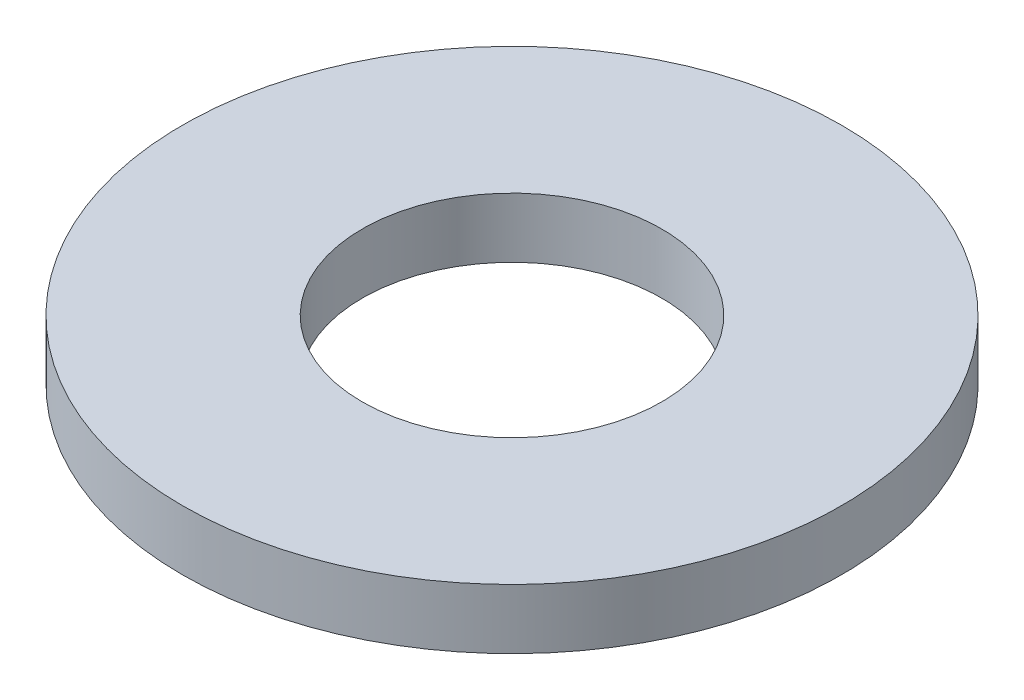
ISO-10303-21;
HEADER;
FILE_DESCRIPTION(('STEP AP214'),'2;1');
FILE_NAME('part.step','',(''),(''),'','','');
FILE_SCHEMA(('AUTOMOTIVE_DESIGN { 1 0 10303 214 1 1 1 1 }'));
ENDSEC;
DATA;
#1=APPLICATION_CONTEXT('core data for automotive mechanical design processes');
#2=APPLICATION_PROTOCOL_DEFINITION('international standard','automotive_design',2000,#1);
#3=PRODUCT_CONTEXT('',#1,'mechanical');
#4=PRODUCT('Part','Part','',(#3));
#5=PRODUCT_RELATED_PRODUCT_CATEGORY('part','',(#4));
#6=PRODUCT_DEFINITION_FORMATION('','',#4);
#7=PRODUCT_DEFINITION_CONTEXT('part definition',#1,'design');
#8=PRODUCT_DEFINITION('design','',#6,#7);
#9=PRODUCT_DEFINITION_SHAPE('','',#8);
#10=(LENGTH_UNIT() NAMED_UNIT(*) SI_UNIT(.MILLI.,.METRE.));
#11=(NAMED_UNIT(*) PLANE_ANGLE_UNIT() SI_UNIT($,.RADIAN.));
#12=(NAMED_UNIT(*) SI_UNIT($,.STERADIAN.) SOLID_ANGLE_UNIT());
#13=UNCERTAINTY_MEASURE_WITH_UNIT(LENGTH_MEASURE(1.E-05),#10,'distance_accuracy_value','');
#14=(GEOMETRIC_REPRESENTATION_CONTEXT(3) GLOBAL_UNCERTAINTY_ASSIGNED_CONTEXT((#13)) GLOBAL_UNIT_ASSIGNED_CONTEXT((#10,
#11,#12)) REPRESENTATION_CONTEXT('',''));
#15=CARTESIAN_POINT('',(0.,0.,0.));
#16=DIRECTION('',(0.,0.,1.));
#17=DIRECTION('',(1.,0.,0.));
#18=AXIS2_PLACEMENT_3D('',#15,#16,#17);
#19=CARTESIAN_POINT('',(0.,0.5,0.));
#20=DIRECTION('',(0.,1.,0.));
#21=DIRECTION('',(0.,0.,1.));
#22=AXIS2_PLACEMENT_3D('',#19,#20,#21);
#23=PLANE('',#22);
#24=CARTESIAN_POINT('',(0.,0.5,0.));
#25=DIRECTION('',(0.,1.,0.));
#26=DIRECTION('',(0.,0.,1.));
#27=AXIS2_PLACEMENT_3D('',#24,#25,#26);
#28=CIRCLE('',#27,2.75);
#29=CARTESIAN_POINT('',(0.,0.5,2.75));
#30=VERTEX_POINT('',#29);
#31=EDGE_CURVE('E10',#30,#30,#28,.T.);
#32=ORIENTED_EDGE('',*,*,#31,.T.);
#33=EDGE_LOOP('',(#32));
#34=FACE_BOUND('',#33,.T.);
#35=CARTESIAN_POINT('',(0.,0.5,0.));
#36=DIRECTION('',(0.,1.,0.));
#37=DIRECTION('',(0.,0.,1.));
#38=AXIS2_PLACEMENT_3D('',#35,#36,#37);
#39=CIRCLE('',#38,1.25);
#40=CARTESIAN_POINT('',(0.,0.5,1.25));
#41=VERTEX_POINT('',#40);
#42=EDGE_CURVE('E42',#41,#41,#39,.T.);
#43=ORIENTED_EDGE('',*,*,#42,.F.);
#44=EDGE_LOOP('',(#43));
#45=FACE_BOUND('',#44,.T.);
#46=ADVANCED_FACE('F31',(#34,#45),#23,.T.);
#47=CARTESIAN_POINT('',(0.,0.,0.));
#48=DIRECTION('',(0.,1.,0.));
#49=DIRECTION('',(0.,0.,1.));
#50=AXIS2_PLACEMENT_3D('',#47,#48,#49);
#51=PLANE('',#50);
#52=CARTESIAN_POINT('',(0.,0.,0.));
#53=DIRECTION('',(0.,1.,0.));
#54=DIRECTION('',(0.,0.,1.));
#55=AXIS2_PLACEMENT_3D('',#52,#53,#54);
#56=CIRCLE('',#55,2.75);
#57=CARTESIAN_POINT('',(0.,0.,2.75));
#58=VERTEX_POINT('',#57);
#59=EDGE_CURVE('E35',#58,#58,#56,.T.);
#60=ORIENTED_EDGE('',*,*,#59,.F.);
#61=EDGE_LOOP('',(#60));
#62=FACE_BOUND('',#61,.T.);
#63=CARTESIAN_POINT('',(0.,0.,0.));
#64=DIRECTION('',(0.,1.,0.));
#65=DIRECTION('',(0.,0.,1.));
#66=AXIS2_PLACEMENT_3D('',#63,#64,#65);
#67=CIRCLE('',#66,1.25);
#68=CARTESIAN_POINT('',(0.,0.,1.25));
#69=VERTEX_POINT('',#68);
#70=EDGE_CURVE('E44',#69,#69,#67,.T.);
#71=ORIENTED_EDGE('',*,*,#70,.T.);
#72=EDGE_LOOP('',(#71));
#73=FACE_BOUND('',#72,.T.);
#74=ADVANCED_FACE('F54',(#62,#73),#51,.F.);
#75=CARTESIAN_POINT('',(0.,0.5,0.));
#76=DIRECTION('',(0.,-1.,0.));
#77=DIRECTION('',(0.,0.,-1.));
#78=AXIS2_PLACEMENT_3D('',#75,#76,#77);
#79=CYLINDRICAL_SURFACE('',#78,2.75);
#80=ORIENTED_EDGE('',*,*,#31,.F.);
#81=EDGE_LOOP('',(#80));
#82=FACE_BOUND('',#81,.T.);
#83=ORIENTED_EDGE('',*,*,#59,.T.);
#84=EDGE_LOOP('',(#83));
#85=FACE_BOUND('',#84,.T.);
#86=ADVANCED_FACE('F33',(#82,#85),#79,.T.);
#87=CARTESIAN_POINT('',(0.,0.5,0.));
#88=DIRECTION('',(0.,-1.,0.));
#89=DIRECTION('',(0.,0.,-1.));
#90=AXIS2_PLACEMENT_3D('',#87,#88,#89);
#91=CYLINDRICAL_SURFACE('',#90,1.25);
#92=ORIENTED_EDGE('',*,*,#42,.T.);
#93=EDGE_LOOP('',(#92));
#94=FACE_BOUND('',#93,.T.);
#95=ORIENTED_EDGE('',*,*,#70,.F.);
#96=EDGE_LOOP('',(#95));
#97=FACE_BOUND('',#96,.T.);
#98=ADVANCED_FACE('F50',(#94,#97),#91,.F.);
#99=CLOSED_SHELL('',(#46,#74,#86,#98));
#100=MANIFOLD_SOLID_BREP('B2',#99);
#101=ADVANCED_BREP_SHAPE_REPRESENTATION('',(#18,#100),#14);
#102=SHAPE_DEFINITION_REPRESENTATION(#9,#101);
ENDSEC;
END-ISO-10303-21;
